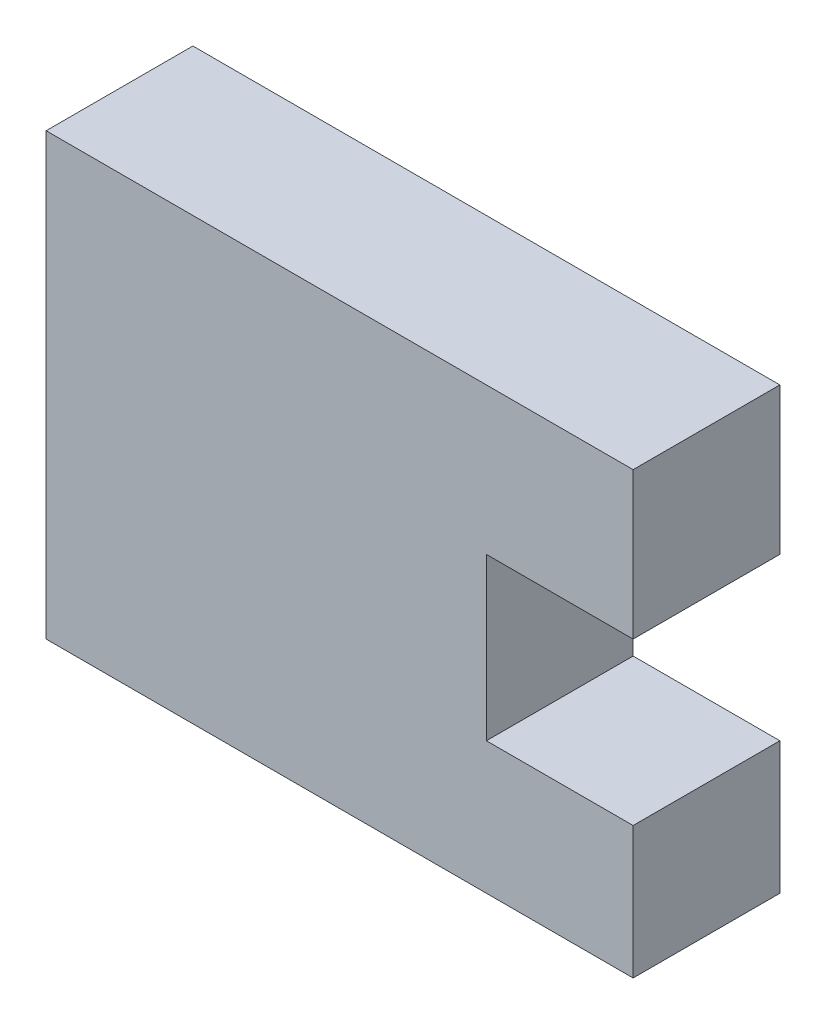
ISO-10303-21;
HEADER;
FILE_DESCRIPTION(('STEP AP214'),'2;1');
FILE_NAME('part.step','',(''),(''),'','','');
FILE_SCHEMA(('AUTOMOTIVE_DESIGN { 1 0 10303 214 1 1 1 1 }'));
ENDSEC;
DATA;
#1=APPLICATION_CONTEXT('core data for automotive mechanical design processes');
#2=APPLICATION_PROTOCOL_DEFINITION('international standard','automotive_design',2000,#1);
#3=PRODUCT_CONTEXT('',#1,'mechanical');
#4=PRODUCT('Part','Part','',(#3));
#5=PRODUCT_RELATED_PRODUCT_CATEGORY('part','',(#4));
#6=PRODUCT_DEFINITION_FORMATION('','',#4);
#7=PRODUCT_DEFINITION_CONTEXT('part definition',#1,'design');
#8=PRODUCT_DEFINITION('design','',#6,#7);
#9=PRODUCT_DEFINITION_SHAPE('','',#8);
#10=(LENGTH_UNIT() NAMED_UNIT(*) SI_UNIT(.MILLI.,.METRE.));
#11=(NAMED_UNIT(*) PLANE_ANGLE_UNIT() SI_UNIT($,.RADIAN.));
#12=(NAMED_UNIT(*) SI_UNIT($,.STERADIAN.) SOLID_ANGLE_UNIT());
#13=UNCERTAINTY_MEASURE_WITH_UNIT(LENGTH_MEASURE(1.E-05),#10,'distance_accuracy_value','');
#14=(GEOMETRIC_REPRESENTATION_CONTEXT(3) GLOBAL_UNCERTAINTY_ASSIGNED_CONTEXT((#13)) GLOBAL_UNIT_ASSIGNED_CONTEXT((#10,
#11,#12)) REPRESENTATION_CONTEXT('',''));
#15=CARTESIAN_POINT('',(0.,0.,0.));
#16=DIRECTION('',(0.,0.,1.));
#17=DIRECTION('',(1.,0.,0.));
#18=AXIS2_PLACEMENT_3D('',#15,#16,#17);
#19=CARTESIAN_POINT('',(0.,0.,20.));
#20=DIRECTION('',(1.,0.,0.));
#21=DIRECTION('',(0.,0.,-1.));
#22=AXIS2_PLACEMENT_3D('',#19,#20,#21);
#23=PLANE('',#22);
#24=DIRECTION('',(0.,-1.,0.));
#25=VECTOR('',#24,1.);
#26=CARTESIAN_POINT('',(0.,0.,0.));
#27=LINE('',#26,#25);
#28=CARTESIAN_POINT('',(0.,60.,0.));
#29=VERTEX_POINT('',#28);
#30=CARTESIAN_POINT('',(0.,0.,0.));
#31=VERTEX_POINT('',#30);
#32=EDGE_CURVE('E129',#29,#31,#27,.T.);
#33=ORIENTED_EDGE('',*,*,#32,.T.);
#34=DIRECTION('',(0.,0.,-1.));
#35=VECTOR('',#34,1.);
#36=CARTESIAN_POINT('',(0.,0.,20.));
#37=LINE('',#36,#35);
#38=CARTESIAN_POINT('',(0.,0.,20.));
#39=VERTEX_POINT('',#38);
#40=EDGE_CURVE('E11',#39,#31,#37,.T.);
#41=ORIENTED_EDGE('',*,*,#40,.F.);
#42=DIRECTION('',(0.,-1.,0.));
#43=VECTOR('',#42,1.);
#44=CARTESIAN_POINT('',(0.,0.,20.));
#45=LINE('',#44,#43);
#46=CARTESIAN_POINT('',(0.,60.,20.));
#47=VERTEX_POINT('',#46);
#48=EDGE_CURVE('E143',#47,#39,#45,.T.);
#49=ORIENTED_EDGE('',*,*,#48,.F.);
#50=DIRECTION('',(0.,0.,-1.));
#51=VECTOR('',#50,1.);
#52=CARTESIAN_POINT('',(0.,60.,20.));
#53=LINE('',#52,#51);
#54=EDGE_CURVE('E125',#47,#29,#53,.T.);
#55=ORIENTED_EDGE('',*,*,#54,.T.);
#56=EDGE_LOOP('',(#33,#41,#49,#55));
#57=FACE_BOUND('',#56,.T.);
#58=ADVANCED_FACE('F33',(#57),#23,.F.);
#59=CARTESIAN_POINT('',(0.,0.,20.));
#60=DIRECTION('',(0.,1.,0.));
#61=DIRECTION('',(0.,0.,1.));
#62=AXIS2_PLACEMENT_3D('',#59,#60,#61);
#63=PLANE('',#62);
#64=DIRECTION('',(1.,0.,0.));
#65=VECTOR('',#64,1.);
#66=CARTESIAN_POINT('',(0.,0.,0.));
#67=LINE('',#66,#65);
#68=CARTESIAN_POINT('',(80.,0.,0.));
#69=VERTEX_POINT('',#68);
#70=EDGE_CURVE('E132',#31,#69,#67,.T.);
#71=ORIENTED_EDGE('',*,*,#70,.T.);
#72=DIRECTION('',(0.,0.,-1.));
#73=VECTOR('',#72,1.);
#74=CARTESIAN_POINT('',(80.,0.,20.));
#75=LINE('',#74,#73);
#76=CARTESIAN_POINT('',(80.,0.,20.));
#77=VERTEX_POINT('',#76);
#78=EDGE_CURVE('E41',#77,#69,#75,.T.);
#79=ORIENTED_EDGE('',*,*,#78,.F.);
#80=DIRECTION('',(1.,0.,0.));
#81=VECTOR('',#80,1.);
#82=CARTESIAN_POINT('',(0.,0.,20.));
#83=LINE('',#82,#81);
#84=EDGE_CURVE('E92',#39,#77,#83,.T.);
#85=ORIENTED_EDGE('',*,*,#84,.F.);
#86=ORIENTED_EDGE('',*,*,#40,.T.);
#87=EDGE_LOOP('',(#71,#79,#85,#86));
#88=FACE_BOUND('',#87,.T.);
#89=ADVANCED_FACE('F178',(#88),#63,.F.);
#90=CARTESIAN_POINT('',(80.,0.,20.));
#91=DIRECTION('',(-1.,0.,0.));
#92=DIRECTION('',(0.,0.,1.));
#93=AXIS2_PLACEMENT_3D('',#90,#91,#92);
#94=PLANE('',#93);
#95=DIRECTION('',(0.,1.,0.));
#96=VECTOR('',#95,1.);
#97=CARTESIAN_POINT('',(80.,0.,0.));
#98=LINE('',#97,#96);
#99=CARTESIAN_POINT('',(80.,18.,0.));
#100=VERTEX_POINT('',#99);
#101=EDGE_CURVE('E134',#69,#100,#98,.T.);
#102=ORIENTED_EDGE('',*,*,#101,.T.);
#103=DIRECTION('',(0.,0.,-1.));
#104=VECTOR('',#103,1.);
#105=CARTESIAN_POINT('',(80.,18.,20.));
#106=LINE('',#105,#104);
#107=CARTESIAN_POINT('',(80.,18.,20.));
#108=VERTEX_POINT('',#107);
#109=EDGE_CURVE('E150',#108,#100,#106,.T.);
#110=ORIENTED_EDGE('',*,*,#109,.F.);
#111=DIRECTION('',(0.,1.,0.));
#112=VECTOR('',#111,1.);
#113=CARTESIAN_POINT('',(80.,0.,20.));
#114=LINE('',#113,#112);
#115=EDGE_CURVE('E158',#77,#108,#114,.T.);
#116=ORIENTED_EDGE('',*,*,#115,.F.);
#117=ORIENTED_EDGE('',*,*,#78,.T.);
#118=EDGE_LOOP('',(#102,#110,#116,#117));
#119=FACE_BOUND('',#118,.T.);
#120=ADVANCED_FACE('F156',(#119),#94,.F.);
#121=CARTESIAN_POINT('',(60.,18.,20.));
#122=DIRECTION('',(0.,-1.,0.));
#123=DIRECTION('',(0.,0.,-1.));
#124=AXIS2_PLACEMENT_3D('',#121,#122,#123);
#125=PLANE('',#124);
#126=DIRECTION('',(-1.,0.,0.));
#127=VECTOR('',#126,1.);
#128=CARTESIAN_POINT('',(60.,18.,0.));
#129=LINE('',#128,#127);
#130=CARTESIAN_POINT('',(60.,18.,0.));
#131=VERTEX_POINT('',#130);
#132=EDGE_CURVE('E136',#100,#131,#129,.T.);
#133=ORIENTED_EDGE('',*,*,#132,.T.);
#134=DIRECTION('',(0.,0.,-1.));
#135=VECTOR('',#134,1.);
#136=CARTESIAN_POINT('',(60.,18.,20.));
#137=LINE('',#136,#135);
#138=CARTESIAN_POINT('',(60.,18.,20.));
#139=VERTEX_POINT('',#138);
#140=EDGE_CURVE('E147',#139,#131,#137,.T.);
#141=ORIENTED_EDGE('',*,*,#140,.F.);
#142=DIRECTION('',(-1.,0.,0.));
#143=VECTOR('',#142,1.);
#144=CARTESIAN_POINT('',(60.,18.,20.));
#145=LINE('',#144,#143);
#146=EDGE_CURVE('E170',#108,#139,#145,.T.);
#147=ORIENTED_EDGE('',*,*,#146,.F.);
#148=ORIENTED_EDGE('',*,*,#109,.T.);
#149=EDGE_LOOP('',(#133,#141,#147,#148));
#150=FACE_BOUND('',#149,.T.);
#151=ADVANCED_FACE('F166',(#150),#125,.F.);
#152=CARTESIAN_POINT('',(60.,40.,20.));
#153=DIRECTION('',(-1.,0.,0.));
#154=DIRECTION('',(0.,0.,1.));
#155=AXIS2_PLACEMENT_3D('',#152,#153,#154);
#156=PLANE('',#155);
#157=DIRECTION('',(0.,1.,0.));
#158=VECTOR('',#157,1.);
#159=CARTESIAN_POINT('',(60.,40.,0.));
#160=LINE('',#159,#158);
#161=CARTESIAN_POINT('',(60.,40.,0.));
#162=VERTEX_POINT('',#161);
#163=EDGE_CURVE('E138',#131,#162,#160,.T.);
#164=ORIENTED_EDGE('',*,*,#163,.T.);
#165=DIRECTION('',(0.,0.,-1.));
#166=VECTOR('',#165,1.);
#167=CARTESIAN_POINT('',(60.,40.,20.));
#168=LINE('',#167,#166);
#169=CARTESIAN_POINT('',(60.,40.,20.));
#170=VERTEX_POINT('',#169);
#171=EDGE_CURVE('E120',#170,#162,#168,.T.);
#172=ORIENTED_EDGE('',*,*,#171,.F.);
#173=DIRECTION('',(0.,1.,0.));
#174=VECTOR('',#173,1.);
#175=CARTESIAN_POINT('',(60.,40.,20.));
#176=LINE('',#175,#174);
#177=EDGE_CURVE('E111',#139,#170,#176,.T.);
#178=ORIENTED_EDGE('',*,*,#177,.F.);
#179=ORIENTED_EDGE('',*,*,#140,.T.);
#180=EDGE_LOOP('',(#164,#172,#178,#179));
#181=FACE_BOUND('',#180,.T.);
#182=ADVANCED_FACE('F169',(#181),#156,.F.);
#183=CARTESIAN_POINT('',(80.,40.,20.));
#184=DIRECTION('',(0.,1.,0.));
#185=DIRECTION('',(-1.,0.,0.));
#186=AXIS2_PLACEMENT_3D('',#183,#184,#185);
#187=PLANE('',#186);
#188=DIRECTION('',(1.,0.,0.));
#189=VECTOR('',#188,1.);
#190=CARTESIAN_POINT('',(80.,40.,0.));
#191=LINE('',#190,#189);
#192=CARTESIAN_POINT('',(80.,40.,0.));
#193=VERTEX_POINT('',#192);
#194=EDGE_CURVE('E119',#162,#193,#191,.T.);
#195=ORIENTED_EDGE('',*,*,#194,.T.);
#196=DIRECTION('',(0.,0.,-1.));
#197=VECTOR('',#196,1.);
#198=CARTESIAN_POINT('',(80.,40.,20.));
#199=LINE('',#198,#197);
#200=CARTESIAN_POINT('',(80.,40.,20.));
#201=VERTEX_POINT('',#200);
#202=EDGE_CURVE('E116',#201,#193,#199,.T.);
#203=ORIENTED_EDGE('',*,*,#202,.F.);
#204=DIRECTION('',(1.,0.,0.));
#205=VECTOR('',#204,1.);
#206=CARTESIAN_POINT('',(80.,40.,20.));
#207=LINE('',#206,#205);
#208=EDGE_CURVE('E105',#170,#201,#207,.T.);
#209=ORIENTED_EDGE('',*,*,#208,.F.);
#210=ORIENTED_EDGE('',*,*,#171,.T.);
#211=EDGE_LOOP('',(#195,#203,#209,#210));
#212=FACE_BOUND('',#211,.T.);
#213=ADVANCED_FACE('F117',(#212),#187,.F.);
#214=CARTESIAN_POINT('',(80.,40.,20.));
#215=DIRECTION('',(-1.,0.,0.));
#216=DIRECTION('',(0.,0.,1.));
#217=AXIS2_PLACEMENT_3D('',#214,#215,#216);
#218=PLANE('',#217);
#219=DIRECTION('',(0.,1.,0.));
#220=VECTOR('',#219,1.);
#221=CARTESIAN_POINT('',(80.,40.,0.));
#222=LINE('',#221,#220);
#223=CARTESIAN_POINT('',(80.,60.,0.));
#224=VERTEX_POINT('',#223);
#225=EDGE_CURVE('E78',#193,#224,#222,.T.);
#226=ORIENTED_EDGE('',*,*,#225,.T.);
#227=DIRECTION('',(0.,0.,-1.));
#228=VECTOR('',#227,1.);
#229=CARTESIAN_POINT('',(80.,60.,20.));
#230=LINE('',#229,#228);
#231=CARTESIAN_POINT('',(80.,60.,20.));
#232=VERTEX_POINT('',#231);
#233=EDGE_CURVE('E121',#232,#224,#230,.T.);
#234=ORIENTED_EDGE('',*,*,#233,.F.);
#235=DIRECTION('',(0.,1.,0.));
#236=VECTOR('',#235,1.);
#237=CARTESIAN_POINT('',(80.,40.,20.));
#238=LINE('',#237,#236);
#239=EDGE_CURVE('E109',#201,#232,#238,.T.);
#240=ORIENTED_EDGE('',*,*,#239,.F.);
#241=ORIENTED_EDGE('',*,*,#202,.T.);
#242=EDGE_LOOP('',(#226,#234,#240,#241));
#243=FACE_BOUND('',#242,.T.);
#244=ADVANCED_FACE('F123',(#243),#218,.F.);
#245=CARTESIAN_POINT('',(0.,60.,20.));
#246=DIRECTION('',(0.,-1.,0.));
#247=DIRECTION('',(0.,0.,-1.));
#248=AXIS2_PLACEMENT_3D('',#245,#246,#247);
#249=PLANE('',#248);
#250=DIRECTION('',(-1.,0.,0.));
#251=VECTOR('',#250,1.);
#252=CARTESIAN_POINT('',(0.,60.,0.));
#253=LINE('',#252,#251);
#254=EDGE_CURVE('E84',#224,#29,#253,.T.);
#255=ORIENTED_EDGE('',*,*,#254,.T.);
#256=ORIENTED_EDGE('',*,*,#54,.F.);
#257=DIRECTION('',(-1.,0.,0.));
#258=VECTOR('',#257,1.);
#259=CARTESIAN_POINT('',(0.,60.,20.));
#260=LINE('',#259,#258);
#261=EDGE_CURVE('E49',#232,#47,#260,.T.);
#262=ORIENTED_EDGE('',*,*,#261,.F.);
#263=ORIENTED_EDGE('',*,*,#233,.T.);
#264=EDGE_LOOP('',(#255,#256,#262,#263));
#265=FACE_BOUND('',#264,.T.);
#266=ADVANCED_FACE('F194',(#265),#249,.F.);
#267=CARTESIAN_POINT('',(0.,0.,20.));
#268=DIRECTION('',(0.,0.,-1.));
#269=DIRECTION('',(-1.,0.,0.));
#270=AXIS2_PLACEMENT_3D('',#267,#268,#269);
#271=PLANE('',#270);
#272=ORIENTED_EDGE('',*,*,#48,.T.);
#273=ORIENTED_EDGE('',*,*,#84,.T.);
#274=ORIENTED_EDGE('',*,*,#115,.T.);
#275=ORIENTED_EDGE('',*,*,#146,.T.);
#276=ORIENTED_EDGE('',*,*,#177,.T.);
#277=ORIENTED_EDGE('',*,*,#208,.T.);
#278=ORIENTED_EDGE('',*,*,#239,.T.);
#279=ORIENTED_EDGE('',*,*,#261,.T.);
#280=EDGE_LOOP('',(#272,#273,#274,#275,#276,#277,#278,#279));
#281=FACE_BOUND('',#280,.T.);
#282=ADVANCED_FACE('F107',(#281),#271,.F.);
#283=CARTESIAN_POINT('',(0.,0.,0.));
#284=DIRECTION('',(0.,0.,-1.));
#285=DIRECTION('',(-1.,0.,0.));
#286=AXIS2_PLACEMENT_3D('',#283,#284,#285);
#287=PLANE('',#286);
#288=ORIENTED_EDGE('',*,*,#32,.F.);
#289=ORIENTED_EDGE('',*,*,#254,.F.);
#290=ORIENTED_EDGE('',*,*,#225,.F.);
#291=ORIENTED_EDGE('',*,*,#194,.F.);
#292=ORIENTED_EDGE('',*,*,#163,.F.);
#293=ORIENTED_EDGE('',*,*,#132,.F.);
#294=ORIENTED_EDGE('',*,*,#101,.F.);
#295=ORIENTED_EDGE('',*,*,#70,.F.);
#296=EDGE_LOOP('',(#288,#289,#290,#291,#292,#293,#294,#295));
#297=FACE_BOUND('',#296,.T.);
#298=ADVANCED_FACE('F162',(#297),#287,.T.);
#299=CLOSED_SHELL('',(#58,#89,#120,#151,#182,#213,#244,#266,#282,#298));
#300=MANIFOLD_SOLID_BREP('B2',#299);
#301=ADVANCED_BREP_SHAPE_REPRESENTATION('',(#18,#300),#14);
#302=SHAPE_DEFINITION_REPRESENTATION(#9,#301);
ENDSEC;
END-ISO-10303-21;
